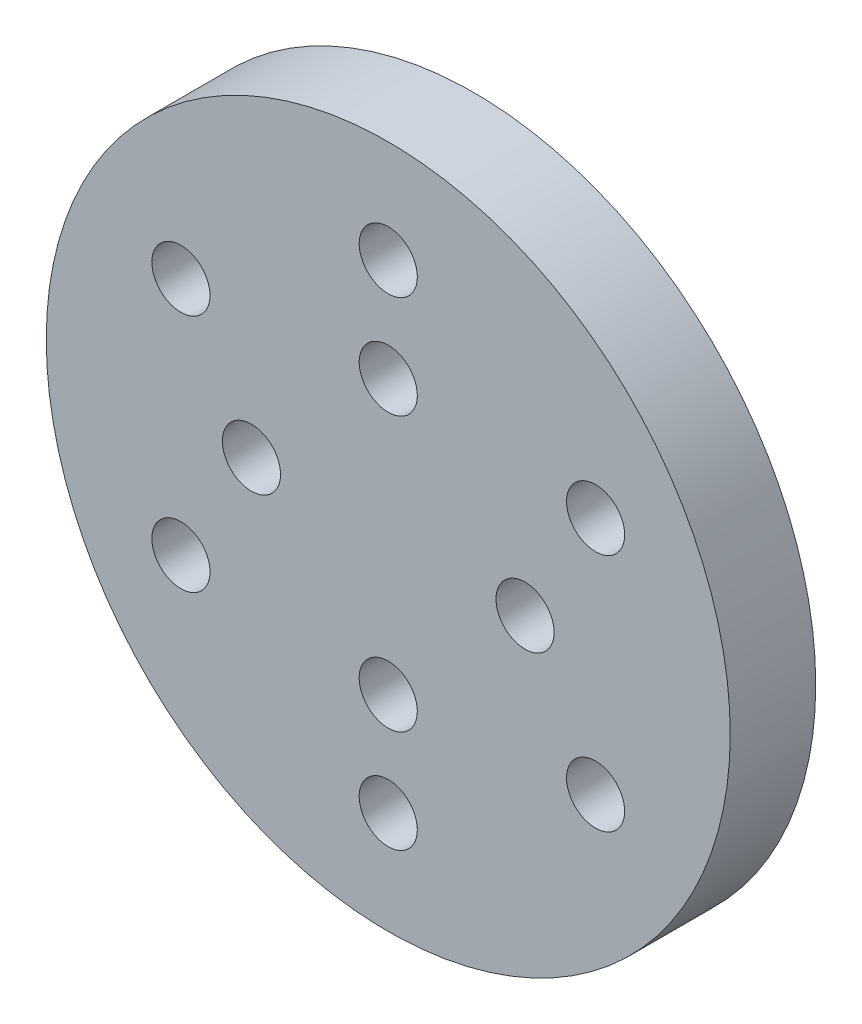
ISO-10303-21;
HEADER;
FILE_DESCRIPTION(('STEP AP214'),'2;1');
FILE_NAME('part.step','',(''),(''),'','','');
FILE_SCHEMA(('AUTOMOTIVE_DESIGN { 1 0 10303 214 1 1 1 1 }'));
ENDSEC;
DATA;
#1=APPLICATION_CONTEXT('core data for automotive mechanical design processes');
#2=APPLICATION_PROTOCOL_DEFINITION('international standard','automotive_design',2000,#1);
#3=PRODUCT_CONTEXT('',#1,'mechanical');
#4=PRODUCT('Part','Part','',(#3));
#5=PRODUCT_RELATED_PRODUCT_CATEGORY('part','',(#4));
#6=PRODUCT_DEFINITION_FORMATION('','',#4);
#7=PRODUCT_DEFINITION_CONTEXT('part definition',#1,'design');
#8=PRODUCT_DEFINITION('design','',#6,#7);
#9=PRODUCT_DEFINITION_SHAPE('','',#8);
#10=(LENGTH_UNIT() NAMED_UNIT(*) SI_UNIT(.MILLI.,.METRE.));
#11=(NAMED_UNIT(*) PLANE_ANGLE_UNIT() SI_UNIT($,.RADIAN.));
#12=(NAMED_UNIT(*) SI_UNIT($,.STERADIAN.) SOLID_ANGLE_UNIT());
#13=UNCERTAINTY_MEASURE_WITH_UNIT(LENGTH_MEASURE(1.E-05),#10,'distance_accuracy_value','');
#14=(GEOMETRIC_REPRESENTATION_CONTEXT(3) GLOBAL_UNCERTAINTY_ASSIGNED_CONTEXT((#13)) GLOBAL_UNIT_ASSIGNED_CONTEXT((#10,
#11,#12)) REPRESENTATION_CONTEXT('',''));
#15=CARTESIAN_POINT('',(0.,0.,0.));
#16=DIRECTION('',(0.,0.,1.));
#17=DIRECTION('',(1.,0.,0.));
#18=AXIS2_PLACEMENT_3D('',#15,#16,#17);
#19=CARTESIAN_POINT('',(0.,0.,5.));
#20=DIRECTION('',(0.,0.,1.));
#21=DIRECTION('',(1.,0.,0.));
#22=AXIS2_PLACEMENT_3D('',#19,#20,#21);
#23=PLANE('',#22);
#24=CARTESIAN_POINT('',(0.,14.,5.));
#25=DIRECTION('',(0.,0.,1.));
#26=DIRECTION('',(1.,0.,0.));
#27=AXIS2_PLACEMENT_3D('',#24,#25,#26);
#28=CIRCLE('',#27,1.7);
#29=CARTESIAN_POINT('',(1.7,14.,5.));
#30=VERTEX_POINT('',#29);
#31=EDGE_CURVE('E95',#30,#30,#28,.T.);
#32=ORIENTED_EDGE('',*,*,#31,.F.);
#33=EDGE_LOOP('',(#32));
#34=FACE_BOUND('',#33,.T.);
#35=CARTESIAN_POINT('',(-12.1243556529819,6.99999999999948,5.));
#36=DIRECTION('',(0.,0.,1.));
#37=DIRECTION('',(1.,0.,0.));
#38=AXIS2_PLACEMENT_3D('',#35,#36,#37);
#39=CIRCLE('',#38,1.7000000000006);
#40=CARTESIAN_POINT('',(-10.4243556529812,6.99999999999948,5.));
#41=VERTEX_POINT('',#40);
#42=EDGE_CURVE('E96',#41,#41,#39,.T.);
#43=ORIENTED_EDGE('',*,*,#42,.F.);
#44=EDGE_LOOP('',(#43));
#45=FACE_BOUND('',#44,.T.);
#46=CARTESIAN_POINT('',(-12.1243556529812,-7.00000000000052,5.));
#47=DIRECTION('',(0.,0.,1.));
#48=DIRECTION('',(1.,0.,0.));
#49=AXIS2_PLACEMENT_3D('',#46,#47,#48);
#50=CIRCLE('',#49,1.70000000000114);
#51=CARTESIAN_POINT('',(-10.4243556529801,-7.00000000000052,5.));
#52=VERTEX_POINT('',#51);
#53=EDGE_CURVE('E70',#52,#52,#50,.T.);
#54=ORIENTED_EDGE('',*,*,#53,.F.);
#55=EDGE_LOOP('',(#54));
#56=FACE_BOUND('',#55,.T.);
#57=CARTESIAN_POINT('',(1.18856827952055E-12,-14.,5.));
#58=DIRECTION('',(0.,0.,1.));
#59=DIRECTION('',(1.,0.,0.));
#60=AXIS2_PLACEMENT_3D('',#57,#58,#59);
#61=CIRCLE('',#60,1.70000000000123);
#62=CARTESIAN_POINT('',(1.70000000000242,-14.,5.));
#63=VERTEX_POINT('',#62);
#64=EDGE_CURVE('E77',#63,#63,#61,.T.);
#65=ORIENTED_EDGE('',*,*,#64,.F.);
#66=EDGE_LOOP('',(#65));
#67=FACE_BOUND('',#66,.T.);
#68=CARTESIAN_POINT('',(12.124355652983,-6.99999999999948,5.));
#69=DIRECTION('',(0.,0.,1.));
#70=DIRECTION('',(1.,0.,0.));
#71=AXIS2_PLACEMENT_3D('',#68,#69,#70);
#72=CIRCLE('',#71,1.70000000000077);
#73=CARTESIAN_POINT('',(13.8243556529838,-6.99999999999948,5.));
#74=VERTEX_POINT('',#73);
#75=EDGE_CURVE('E83',#74,#74,#72,.T.);
#76=ORIENTED_EDGE('',*,*,#75,.F.);
#77=EDGE_LOOP('',(#76));
#78=FACE_BOUND('',#77,.T.);
#79=CARTESIAN_POINT('',(12.1243556529824,7.00000000000052,5.));
#80=DIRECTION('',(0.,0.,1.));
#81=DIRECTION('',(1.,0.,0.));
#82=AXIS2_PLACEMENT_3D('',#79,#80,#81);
#83=CIRCLE('',#82,1.70000000000017);
#84=CARTESIAN_POINT('',(13.8243556529826,7.00000000000052,5.));
#85=VERTEX_POINT('',#84);
#86=EDGE_CURVE('E89',#85,#85,#83,.T.);
#87=ORIENTED_EDGE('',*,*,#86,.F.);
#88=EDGE_LOOP('',(#87));
#89=FACE_BOUND('',#88,.T.);
#90=CARTESIAN_POINT('',(4.51808198568511E-13,-8.,5.));
#91=DIRECTION('',(0.,0.,1.));
#92=DIRECTION('',(1.,0.,0.));
#93=AXIS2_PLACEMENT_3D('',#90,#91,#92);
#94=CIRCLE('',#93,1.70000000000049);
#95=CARTESIAN_POINT('',(1.70000000000094,-8.,5.));
#96=VERTEX_POINT('',#95);
#97=EDGE_CURVE('E55',#96,#96,#94,.T.);
#98=ORIENTED_EDGE('',*,*,#97,.F.);
#99=EDGE_LOOP('',(#98));
#100=FACE_BOUND('',#99,.T.);
#101=CARTESIAN_POINT('',(0.,8.,5.));
#102=DIRECTION('',(0.,0.,1.));
#103=DIRECTION('',(1.,0.,0.));
#104=AXIS2_PLACEMENT_3D('',#101,#102,#103);
#105=CIRCLE('',#104,1.7);
#106=CARTESIAN_POINT('',(1.7,8.,5.));
#107=VERTEX_POINT('',#106);
#108=EDGE_CURVE('E44',#107,#107,#105,.T.);
#109=ORIENTED_EDGE('',*,*,#108,.F.);
#110=EDGE_LOOP('',(#109));
#111=FACE_BOUND('',#110,.T.);
#112=CARTESIAN_POINT('',(0.,0.,5.));
#113=DIRECTION('',(0.,0.,1.));
#114=DIRECTION('',(1.,0.,0.));
#115=AXIS2_PLACEMENT_3D('',#112,#113,#114);
#116=CIRCLE('',#115,20.);
#117=CARTESIAN_POINT('',(20.,0.,5.));
#118=VERTEX_POINT('',#117);
#119=EDGE_CURVE('E10',#118,#118,#116,.T.);
#120=ORIENTED_EDGE('',*,*,#119,.T.);
#121=EDGE_LOOP('',(#120));
#122=FACE_BOUND('',#121,.T.);
#123=CARTESIAN_POINT('',(8.,0.,5.));
#124=DIRECTION('',(0.,0.,1.));
#125=DIRECTION('',(1.,0.,0.));
#126=AXIS2_PLACEMENT_3D('',#123,#124,#125);
#127=CIRCLE('',#126,1.7);
#128=CARTESIAN_POINT('',(9.7,0.,5.));
#129=VERTEX_POINT('',#128);
#130=EDGE_CURVE('E49',#129,#129,#127,.T.);
#131=ORIENTED_EDGE('',*,*,#130,.F.);
#132=EDGE_LOOP('',(#131));
#133=FACE_BOUND('',#132,.T.);
#134=CARTESIAN_POINT('',(-8.,0.,5.));
#135=DIRECTION('',(0.,0.,1.));
#136=DIRECTION('',(1.,0.,0.));
#137=AXIS2_PLACEMENT_3D('',#134,#135,#136);
#138=CIRCLE('',#137,1.7);
#139=CARTESIAN_POINT('',(-6.3,0.,5.));
#140=VERTEX_POINT('',#139);
#141=EDGE_CURVE('E61',#140,#140,#138,.T.);
#142=ORIENTED_EDGE('',*,*,#141,.F.);
#143=EDGE_LOOP('',(#142));
#144=FACE_BOUND('',#143,.T.);
#145=ADVANCED_FACE('F33',(#34,#45,#56,#67,#78,#89,#100,#111,#122,#133,#144),#23,.T.);
#146=CARTESIAN_POINT('',(0.,0.,0.));
#147=DIRECTION('',(0.,0.,1.));
#148=DIRECTION('',(1.,0.,0.));
#149=AXIS2_PLACEMENT_3D('',#146,#147,#148);
#150=PLANE('',#149);
#151=CARTESIAN_POINT('',(0.,14.,0.));
#152=DIRECTION('',(0.,0.,1.));
#153=DIRECTION('',(1.,0.,0.));
#154=AXIS2_PLACEMENT_3D('',#151,#152,#153);
#155=CIRCLE('',#154,1.7);
#156=CARTESIAN_POINT('',(1.7,14.,0.));
#157=VERTEX_POINT('',#156);
#158=EDGE_CURVE('E67',#157,#157,#155,.T.);
#159=ORIENTED_EDGE('',*,*,#158,.T.);
#160=EDGE_LOOP('',(#159));
#161=FACE_BOUND('',#160,.T.);
#162=CARTESIAN_POINT('',(-12.1243556529819,6.99999999999948,0.));
#163=DIRECTION('',(0.,0.,1.));
#164=DIRECTION('',(1.,0.,0.));
#165=AXIS2_PLACEMENT_3D('',#162,#163,#164);
#166=CIRCLE('',#165,1.7000000000006);
#167=CARTESIAN_POINT('',(-10.4243556529812,6.99999999999948,0.));
#168=VERTEX_POINT('',#167);
#169=EDGE_CURVE('E74',#168,#168,#166,.T.);
#170=ORIENTED_EDGE('',*,*,#169,.T.);
#171=EDGE_LOOP('',(#170));
#172=FACE_BOUND('',#171,.T.);
#173=CARTESIAN_POINT('',(-12.1243556529812,-7.00000000000052,0.));
#174=DIRECTION('',(0.,0.,1.));
#175=DIRECTION('',(1.,0.,0.));
#176=AXIS2_PLACEMENT_3D('',#173,#174,#175);
#177=CIRCLE('',#176,1.70000000000114);
#178=CARTESIAN_POINT('',(-10.4243556529801,-7.00000000000052,0.));
#179=VERTEX_POINT('',#178);
#180=EDGE_CURVE('E73',#179,#179,#177,.T.);
#181=ORIENTED_EDGE('',*,*,#180,.T.);
#182=EDGE_LOOP('',(#181));
#183=FACE_BOUND('',#182,.T.);
#184=CARTESIAN_POINT('',(1.18856827952055E-12,-14.,0.));
#185=DIRECTION('',(0.,0.,1.));
#186=DIRECTION('',(1.,0.,0.));
#187=AXIS2_PLACEMENT_3D('',#184,#185,#186);
#188=CIRCLE('',#187,1.70000000000123);
#189=CARTESIAN_POINT('',(1.70000000000242,-14.,0.));
#190=VERTEX_POINT('',#189);
#191=EDGE_CURVE('E80',#190,#190,#188,.T.);
#192=ORIENTED_EDGE('',*,*,#191,.T.);
#193=EDGE_LOOP('',(#192));
#194=FACE_BOUND('',#193,.T.);
#195=CARTESIAN_POINT('',(12.124355652983,-6.99999999999948,0.));
#196=DIRECTION('',(0.,0.,1.));
#197=DIRECTION('',(1.,0.,0.));
#198=AXIS2_PLACEMENT_3D('',#195,#196,#197);
#199=CIRCLE('',#198,1.70000000000077);
#200=CARTESIAN_POINT('',(13.8243556529838,-6.99999999999948,0.));
#201=VERTEX_POINT('',#200);
#202=EDGE_CURVE('E86',#201,#201,#199,.T.);
#203=ORIENTED_EDGE('',*,*,#202,.T.);
#204=EDGE_LOOP('',(#203));
#205=FACE_BOUND('',#204,.T.);
#206=CARTESIAN_POINT('',(12.1243556529824,7.00000000000052,0.));
#207=DIRECTION('',(0.,0.,1.));
#208=DIRECTION('',(1.,0.,0.));
#209=AXIS2_PLACEMENT_3D('',#206,#207,#208);
#210=CIRCLE('',#209,1.70000000000017);
#211=CARTESIAN_POINT('',(13.8243556529826,7.00000000000052,0.));
#212=VERTEX_POINT('',#211);
#213=EDGE_CURVE('E92',#212,#212,#210,.T.);
#214=ORIENTED_EDGE('',*,*,#213,.T.);
#215=EDGE_LOOP('',(#214));
#216=FACE_BOUND('',#215,.T.);
#217=CARTESIAN_POINT('',(0.,0.,0.));
#218=DIRECTION('',(0.,0.,1.));
#219=DIRECTION('',(1.,0.,0.));
#220=AXIS2_PLACEMENT_3D('',#217,#218,#219);
#221=CIRCLE('',#220,20.);
#222=CARTESIAN_POINT('',(20.,0.,0.));
#223=VERTEX_POINT('',#222);
#224=EDGE_CURVE('E37',#223,#223,#221,.T.);
#225=ORIENTED_EDGE('',*,*,#224,.F.);
#226=EDGE_LOOP('',(#225));
#227=FACE_BOUND('',#226,.T.);
#228=CARTESIAN_POINT('',(0.,8.,0.));
#229=DIRECTION('',(0.,0.,1.));
#230=DIRECTION('',(1.,0.,0.));
#231=AXIS2_PLACEMENT_3D('',#228,#229,#230);
#232=CIRCLE('',#231,1.7);
#233=CARTESIAN_POINT('',(1.7,8.,0.));
#234=VERTEX_POINT('',#233);
#235=EDGE_CURVE('E46',#234,#234,#232,.T.);
#236=ORIENTED_EDGE('',*,*,#235,.T.);
#237=EDGE_LOOP('',(#236));
#238=FACE_BOUND('',#237,.T.);
#239=CARTESIAN_POINT('',(8.,0.,0.));
#240=DIRECTION('',(0.,0.,1.));
#241=DIRECTION('',(1.,0.,0.));
#242=AXIS2_PLACEMENT_3D('',#239,#240,#241);
#243=CIRCLE('',#242,1.7);
#244=CARTESIAN_POINT('',(9.7,0.,0.));
#245=VERTEX_POINT('',#244);
#246=EDGE_CURVE('E52',#245,#245,#243,.T.);
#247=ORIENTED_EDGE('',*,*,#246,.T.);
#248=EDGE_LOOP('',(#247));
#249=FACE_BOUND('',#248,.T.);
#250=CARTESIAN_POINT('',(4.51808198568511E-13,-8.,0.));
#251=DIRECTION('',(0.,0.,1.));
#252=DIRECTION('',(1.,0.,0.));
#253=AXIS2_PLACEMENT_3D('',#250,#251,#252);
#254=CIRCLE('',#253,1.70000000000049);
#255=CARTESIAN_POINT('',(1.70000000000094,-8.,0.));
#256=VERTEX_POINT('',#255);
#257=EDGE_CURVE('E58',#256,#256,#254,.T.);
#258=ORIENTED_EDGE('',*,*,#257,.T.);
#259=EDGE_LOOP('',(#258));
#260=FACE_BOUND('',#259,.T.);
#261=CARTESIAN_POINT('',(-8.,0.,0.));
#262=DIRECTION('',(0.,0.,1.));
#263=DIRECTION('',(1.,0.,0.));
#264=AXIS2_PLACEMENT_3D('',#261,#262,#263);
#265=CIRCLE('',#264,1.7);
#266=CARTESIAN_POINT('',(-6.3,0.,0.));
#267=VERTEX_POINT('',#266);
#268=EDGE_CURVE('E64',#267,#267,#265,.T.);
#269=ORIENTED_EDGE('',*,*,#268,.T.);
#270=EDGE_LOOP('',(#269));
#271=FACE_BOUND('',#270,.T.);
#272=ADVANCED_FACE('F106',(#161,#172,#183,#194,#205,#216,#227,#238,#249,#260,#271),#150,.F.);
#273=CARTESIAN_POINT('',(0.,0.,5.));
#274=DIRECTION('',(0.,0.,-1.));
#275=DIRECTION('',(-1.,0.,0.));
#276=AXIS2_PLACEMENT_3D('',#273,#274,#275);
#277=CYLINDRICAL_SURFACE('',#276,20.);
#278=ORIENTED_EDGE('',*,*,#119,.F.);
#279=EDGE_LOOP('',(#278));
#280=FACE_BOUND('',#279,.T.);
#281=ORIENTED_EDGE('',*,*,#224,.T.);
#282=EDGE_LOOP('',(#281));
#283=FACE_BOUND('',#282,.T.);
#284=ADVANCED_FACE('F35',(#280,#283),#277,.T.);
#285=CARTESIAN_POINT('',(0.,8.,5.));
#286=DIRECTION('',(0.,0.,-1.));
#287=DIRECTION('',(-1.,0.,0.));
#288=AXIS2_PLACEMENT_3D('',#285,#286,#287);
#289=CYLINDRICAL_SURFACE('',#288,1.7);
#290=ORIENTED_EDGE('',*,*,#108,.T.);
#291=EDGE_LOOP('',(#290));
#292=FACE_BOUND('',#291,.T.);
#293=ORIENTED_EDGE('',*,*,#235,.F.);
#294=EDGE_LOOP('',(#293));
#295=FACE_BOUND('',#294,.T.);
#296=ADVANCED_FACE('F149',(#292,#295),#289,.F.);
#297=CARTESIAN_POINT('',(8.,0.,5.));
#298=DIRECTION('',(0.,0.,-1.));
#299=DIRECTION('',(-1.,0.,0.));
#300=AXIS2_PLACEMENT_3D('',#297,#298,#299);
#301=CYLINDRICAL_SURFACE('',#300,1.7);
#302=ORIENTED_EDGE('',*,*,#130,.T.);
#303=EDGE_LOOP('',(#302));
#304=FACE_BOUND('',#303,.T.);
#305=ORIENTED_EDGE('',*,*,#246,.F.);
#306=EDGE_LOOP('',(#305));
#307=FACE_BOUND('',#306,.T.);
#308=ADVANCED_FACE('F154',(#304,#307),#301,.F.);
#309=CARTESIAN_POINT('',(4.51808198568511E-13,-8.,5.));
#310=DIRECTION('',(0.,0.,-1.));
#311=DIRECTION('',(-1.,0.,0.));
#312=AXIS2_PLACEMENT_3D('',#309,#310,#311);
#313=CYLINDRICAL_SURFACE('',#312,1.70000000000049);
#314=ORIENTED_EDGE('',*,*,#97,.T.);
#315=EDGE_LOOP('',(#314));
#316=FACE_BOUND('',#315,.T.);
#317=ORIENTED_EDGE('',*,*,#257,.F.);
#318=EDGE_LOOP('',(#317));
#319=FACE_BOUND('',#318,.T.);
#320=ADVANCED_FACE('F141',(#316,#319),#313,.F.);
#321=CARTESIAN_POINT('',(-8.,0.,5.));
#322=DIRECTION('',(0.,0.,-1.));
#323=DIRECTION('',(-1.,0.,0.));
#324=AXIS2_PLACEMENT_3D('',#321,#322,#323);
#325=CYLINDRICAL_SURFACE('',#324,1.7);
#326=ORIENTED_EDGE('',*,*,#141,.T.);
#327=EDGE_LOOP('',(#326));
#328=FACE_BOUND('',#327,.T.);
#329=ORIENTED_EDGE('',*,*,#268,.F.);
#330=EDGE_LOOP('',(#329));
#331=FACE_BOUND('',#330,.T.);
#332=ADVANCED_FACE('F137',(#328,#331),#325,.F.);
#333=CARTESIAN_POINT('',(12.1243556529824,7.00000000000052,0.));
#334=DIRECTION('',(0.,0.,1.));
#335=DIRECTION('',(1.,0.,0.));
#336=AXIS2_PLACEMENT_3D('',#333,#334,#335);
#337=CYLINDRICAL_SURFACE('',#336,1.70000000000017);
#338=ORIENTED_EDGE('',*,*,#213,.F.);
#339=EDGE_LOOP('',(#338));
#340=FACE_BOUND('',#339,.T.);
#341=ORIENTED_EDGE('',*,*,#86,.T.);
#342=EDGE_LOOP('',(#341));
#343=FACE_BOUND('',#342,.T.);
#344=ADVANCED_FACE('F140',(#340,#343),#337,.F.);
#345=CARTESIAN_POINT('',(12.124355652983,-6.99999999999948,0.));
#346=DIRECTION('',(0.,0.,1.));
#347=DIRECTION('',(1.,0.,0.));
#348=AXIS2_PLACEMENT_3D('',#345,#346,#347);
#349=CYLINDRICAL_SURFACE('',#348,1.70000000000077);
#350=ORIENTED_EDGE('',*,*,#202,.F.);
#351=EDGE_LOOP('',(#350));
#352=FACE_BOUND('',#351,.T.);
#353=ORIENTED_EDGE('',*,*,#75,.T.);
#354=EDGE_LOOP('',(#353));
#355=FACE_BOUND('',#354,.T.);
#356=ADVANCED_FACE('F169',(#352,#355),#349,.F.);
#357=CARTESIAN_POINT('',(1.18856827952055E-12,-14.,0.));
#358=DIRECTION('',(0.,0.,1.));
#359=DIRECTION('',(1.,0.,0.));
#360=AXIS2_PLACEMENT_3D('',#357,#358,#359);
#361=CYLINDRICAL_SURFACE('',#360,1.70000000000123);
#362=ORIENTED_EDGE('',*,*,#191,.F.);
#363=EDGE_LOOP('',(#362));
#364=FACE_BOUND('',#363,.T.);
#365=ORIENTED_EDGE('',*,*,#64,.T.);
#366=EDGE_LOOP('',(#365));
#367=FACE_BOUND('',#366,.T.);
#368=ADVANCED_FACE('F165',(#364,#367),#361,.F.);
#369=CARTESIAN_POINT('',(-12.1243556529812,-7.00000000000052,0.));
#370=DIRECTION('',(0.,0.,1.));
#371=DIRECTION('',(1.,0.,0.));
#372=AXIS2_PLACEMENT_3D('',#369,#370,#371);
#373=CYLINDRICAL_SURFACE('',#372,1.70000000000114);
#374=ORIENTED_EDGE('',*,*,#180,.F.);
#375=EDGE_LOOP('',(#374));
#376=FACE_BOUND('',#375,.T.);
#377=ORIENTED_EDGE('',*,*,#53,.T.);
#378=EDGE_LOOP('',(#377));
#379=FACE_BOUND('',#378,.T.);
#380=ADVANCED_FACE('F162',(#376,#379),#373,.F.);
#381=CARTESIAN_POINT('',(-12.1243556529819,6.99999999999948,0.));
#382=DIRECTION('',(0.,0.,1.));
#383=DIRECTION('',(1.,0.,0.));
#384=AXIS2_PLACEMENT_3D('',#381,#382,#383);
#385=CYLINDRICAL_SURFACE('',#384,1.7000000000006);
#386=ORIENTED_EDGE('',*,*,#169,.F.);
#387=EDGE_LOOP('',(#386));
#388=FACE_BOUND('',#387,.T.);
#389=ORIENTED_EDGE('',*,*,#42,.T.);
#390=EDGE_LOOP('',(#389));
#391=FACE_BOUND('',#390,.T.);
#392=ADVANCED_FACE('F112',(#388,#391),#385,.F.);
#393=CARTESIAN_POINT('',(0.,14.,0.));
#394=DIRECTION('',(0.,0.,1.));
#395=DIRECTION('',(1.,0.,0.));
#396=AXIS2_PLACEMENT_3D('',#393,#394,#395);
#397=CYLINDRICAL_SURFACE('',#396,1.7);
#398=ORIENTED_EDGE('',*,*,#158,.F.);
#399=EDGE_LOOP('',(#398));
#400=FACE_BOUND('',#399,.T.);
#401=ORIENTED_EDGE('',*,*,#31,.T.);
#402=EDGE_LOOP('',(#401));
#403=FACE_BOUND('',#402,.T.);
#404=ADVANCED_FACE('F109',(#400,#403),#397,.F.);
#405=CLOSED_SHELL('',(#145,#272,#284,#296,#308,#320,#332,#344,#356,#368,#380,#392,#404));
#406=MANIFOLD_SOLID_BREP('B2',#405);
#407=ADVANCED_BREP_SHAPE_REPRESENTATION('',(#18,#406),#14);
#408=SHAPE_DEFINITION_REPRESENTATION(#9,#407);
ENDSEC;
END-ISO-10303-21;
